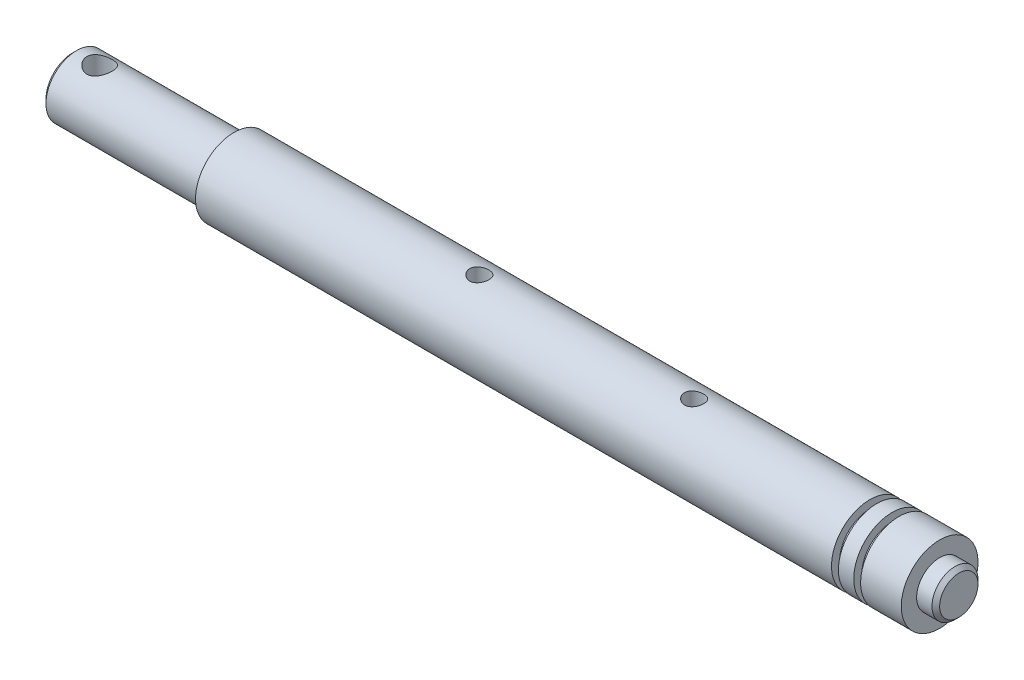
ISO-10303-21;
HEADER;
FILE_DESCRIPTION(('STEP AP214'),'2;1');
FILE_NAME('part.step','',(''),(''),'','','');
FILE_SCHEMA(('AUTOMOTIVE_DESIGN { 1 0 10303 214 1 1 1 1 }'));
ENDSEC;
DATA;
#1=APPLICATION_CONTEXT('core data for automotive mechanical design processes');
#2=APPLICATION_PROTOCOL_DEFINITION('international standard','automotive_design',2000,#1);
#3=PRODUCT_CONTEXT('',#1,'mechanical');
#4=PRODUCT('Part','Part','',(#3));
#5=PRODUCT_RELATED_PRODUCT_CATEGORY('part','',(#4));
#6=PRODUCT_DEFINITION_FORMATION('','',#4);
#7=PRODUCT_DEFINITION_CONTEXT('part definition',#1,'design');
#8=PRODUCT_DEFINITION('design','',#6,#7);
#9=PRODUCT_DEFINITION_SHAPE('','',#8);
#10=(LENGTH_UNIT() NAMED_UNIT(*) SI_UNIT(.MILLI.,.METRE.));
#11=(NAMED_UNIT(*) PLANE_ANGLE_UNIT() SI_UNIT($,.RADIAN.));
#12=(NAMED_UNIT(*) SI_UNIT($,.STERADIAN.) SOLID_ANGLE_UNIT());
#13=UNCERTAINTY_MEASURE_WITH_UNIT(LENGTH_MEASURE(1.E-05),#10,'distance_accuracy_value','');
#14=(GEOMETRIC_REPRESENTATION_CONTEXT(3) GLOBAL_UNCERTAINTY_ASSIGNED_CONTEXT((#13)) GLOBAL_UNIT_ASSIGNED_CONTEXT((#10,
#11,#12)) REPRESENTATION_CONTEXT('',''));
#15=CARTESIAN_POINT('',(0.,0.,0.));
#16=DIRECTION('',(0.,0.,1.));
#17=DIRECTION('',(1.,0.,0.));
#18=AXIS2_PLACEMENT_3D('',#15,#16,#17);
#19=CARTESIAN_POINT('',(127.142135623731,0.,0.));
#20=DIRECTION('',(-1.,0.,0.));
#21=DIRECTION('',(0.,0.,1.));
#22=AXIS2_PLACEMENT_3D('',#19,#20,#21);
#23=CYLINDRICAL_SURFACE('',#22,5.);
#24=CARTESIAN_POINT('',(104.8,0.,0.));
#25=DIRECTION('',(1.,0.,0.));
#26=DIRECTION('',(0.,0.,-1.));
#27=AXIS2_PLACEMENT_3D('',#24,#25,#26);
#28=CIRCLE('',#27,5.);
#29=CARTESIAN_POINT('',(104.8,0.,-5.));
#30=VERTEX_POINT('',#29);
#31=EDGE_CURVE('E176',#30,#30,#28,.T.);
#32=ORIENTED_EDGE('',*,*,#31,.T.);
#33=EDGE_LOOP('',(#32));
#34=FACE_BOUND('',#33,.T.);
#35=CARTESIAN_POINT('',(106.8,0.,0.));
#36=DIRECTION('',(1.,0.,0.));
#37=DIRECTION('',(0.,0.,-1.));
#38=AXIS2_PLACEMENT_3D('',#35,#36,#37);
#39=CIRCLE('',#38,5.);
#40=CARTESIAN_POINT('',(106.8,0.,-5.));
#41=VERTEX_POINT('',#40);
#42=EDGE_CURVE('E197',#41,#41,#39,.T.);
#43=ORIENTED_EDGE('',*,*,#42,.F.);
#44=EDGE_LOOP('',(#43));
#45=FACE_BOUND('',#44,.T.);
#46=ADVANCED_FACE('F45',(#34,#45),#23,.T.);
#47=CARTESIAN_POINT('',(107.7,0.,0.));
#48=DIRECTION('',(1.,0.,0.));
#49=DIRECTION('',(0.,0.,-1.));
#50=AXIS2_PLACEMENT_3D('',#47,#48,#49);
#51=PLANE('',#50);
#52=CARTESIAN_POINT('',(107.7,0.,0.));
#53=DIRECTION('',(1.,0.,0.));
#54=DIRECTION('',(0.,0.,-1.));
#55=AXIS2_PLACEMENT_3D('',#52,#53,#54);
#56=CIRCLE('',#55,5.);
#57=CARTESIAN_POINT('',(107.7,0.,-5.));
#58=VERTEX_POINT('',#57);
#59=EDGE_CURVE('E200',#58,#58,#56,.T.);
#60=ORIENTED_EDGE('',*,*,#59,.F.);
#61=EDGE_LOOP('',(#60));
#62=FACE_BOUND('',#61,.T.);
#63=CARTESIAN_POINT('',(107.7,0.,0.));
#64=DIRECTION('',(1.,0.,0.));
#65=DIRECTION('',(0.,0.,-1.));
#66=AXIS2_PLACEMENT_3D('',#63,#64,#65);
#67=CIRCLE('',#66,3.95);
#68=CARTESIAN_POINT('',(107.7,0.,-3.95));
#69=VERTEX_POINT('',#68);
#70=EDGE_CURVE('E194',#69,#69,#67,.T.);
#71=ORIENTED_EDGE('',*,*,#70,.T.);
#72=EDGE_LOOP('',(#71));
#73=FACE_BOUND('',#72,.T.);
#74=ADVANCED_FACE('F106',(#62,#73),#51,.F.);
#75=CARTESIAN_POINT('',(106.8,0.,0.));
#76=DIRECTION('',(1.,0.,0.));
#77=DIRECTION('',(0.,0.,-1.));
#78=AXIS2_PLACEMENT_3D('',#75,#76,#77);
#79=PLANE('',#78);
#80=ORIENTED_EDGE('',*,*,#42,.T.);
#81=EDGE_LOOP('',(#80));
#82=FACE_BOUND('',#81,.T.);
#83=CARTESIAN_POINT('',(106.8,0.,0.));
#84=DIRECTION('',(1.,0.,0.));
#85=DIRECTION('',(0.,0.,-1.));
#86=AXIS2_PLACEMENT_3D('',#83,#84,#85);
#87=CIRCLE('',#86,3.95);
#88=CARTESIAN_POINT('',(106.8,0.,-3.95));
#89=VERTEX_POINT('',#88);
#90=EDGE_CURVE('E188',#89,#89,#87,.T.);
#91=ORIENTED_EDGE('',*,*,#90,.F.);
#92=EDGE_LOOP('',(#91));
#93=FACE_BOUND('',#92,.T.);
#94=ADVANCED_FACE('F104',(#82,#93),#79,.T.);
#95=CARTESIAN_POINT('',(107.7,0.,0.));
#96=DIRECTION('',(-1.,0.,0.));
#97=DIRECTION('',(0.,0.,1.));
#98=AXIS2_PLACEMENT_3D('',#95,#96,#97);
#99=CYLINDRICAL_SURFACE('',#98,3.95);
#100=ORIENTED_EDGE('',*,*,#70,.F.);
#101=EDGE_LOOP('',(#100));
#102=FACE_BOUND('',#101,.T.);
#103=ORIENTED_EDGE('',*,*,#90,.T.);
#104=EDGE_LOOP('',(#103));
#105=FACE_BOUND('',#104,.T.);
#106=ADVANCED_FACE('F100',(#102,#105),#99,.T.);
#107=CARTESIAN_POINT('',(113.,-5.23389152438003,-13.8872740129595));
#108=DIRECTION('',(-1.,0.,0.));
#109=DIRECTION('',(0.,-0.978261327387222,-0.207375927577406));
#110=AXIS2_PLACEMENT_3D('',#107,#108,#109);
#111=PLANE('',#110);
#112=CARTESIAN_POINT('',(113.,0.,0.));
#113=DIRECTION('',(1.,0.,0.));
#114=DIRECTION('',(0.,0.,-1.));
#115=AXIS2_PLACEMENT_3D('',#112,#113,#114);
#116=CIRCLE('',#115,3.00000000000008);
#117=CARTESIAN_POINT('',(113.,0.,-3.00000000000008));
#118=VERTEX_POINT('',#117);
#119=EDGE_CURVE('E190',#118,#118,#116,.T.);
#120=ORIENTED_EDGE('',*,*,#119,.F.);
#121=EDGE_LOOP('',(#120));
#122=FACE_BOUND('',#121,.T.);
#123=CARTESIAN_POINT('',(113.,0.,0.));
#124=DIRECTION('',(-1.,0.,0.));
#125=DIRECTION('',(0.,-1.,0.));
#126=AXIS2_PLACEMENT_3D('',#123,#124,#125);
#127=CIRCLE('',#126,5.);
#128=CARTESIAN_POINT('',(113.,-5.,0.));
#129=VERTEX_POINT('',#128);
#130=EDGE_CURVE('E206',#129,#129,#127,.T.);
#131=ORIENTED_EDGE('',*,*,#130,.F.);
#132=EDGE_LOOP('',(#131));
#133=FACE_BOUND('',#132,.T.);
#134=ADVANCED_FACE('F103',(#122,#133),#111,.F.);
#135=ORIENTED_EDGE('',*,*,#59,.T.);
#136=EDGE_LOOP('',(#135));
#137=FACE_BOUND('',#136,.T.);
#138=ORIENTED_EDGE('',*,*,#130,.T.);
#139=EDGE_LOOP('',(#138));
#140=FACE_BOUND('',#139,.T.);
#141=ADVANCED_FACE('F73',(#137,#140),#23,.T.);
#142=CARTESIAN_POINT('',(115.5,0.,0.));
#143=DIRECTION('',(-1.,0.,0.));
#144=DIRECTION('',(0.,0.,1.));
#145=AXIS2_PLACEMENT_3D('',#142,#143,#144);
#146=CYLINDRICAL_SURFACE('',#145,3.00000000000008);
#147=CARTESIAN_POINT('',(115.,0.,0.));
#148=DIRECTION('',(1.,0.,0.));
#149=DIRECTION('',(0.,0.,-1.));
#150=AXIS2_PLACEMENT_3D('',#147,#148,#149);
#151=CIRCLE('',#150,3.00000000000008);
#152=CARTESIAN_POINT('',(115.,0.,-3.00000000000008));
#153=VERTEX_POINT('',#152);
#154=EDGE_CURVE('E62',#153,#153,#151,.F.);
#155=ORIENTED_EDGE('',*,*,#154,.T.);
#156=EDGE_LOOP('',(#155));
#157=FACE_BOUND('',#156,.T.);
#158=ORIENTED_EDGE('',*,*,#119,.T.);
#159=EDGE_LOOP('',(#158));
#160=FACE_BOUND('',#159,.T.);
#161=ADVANCED_FACE('F95',(#157,#160),#146,.T.);
#162=CARTESIAN_POINT('',(115.5,0.,0.));
#163=DIRECTION('',(1.,0.,0.));
#164=DIRECTION('',(0.,0.,-1.));
#165=AXIS2_PLACEMENT_3D('',#162,#163,#164);
#166=PLANE('',#165);
#167=CARTESIAN_POINT('',(115.5,0.,0.));
#168=DIRECTION('',(1.,0.,0.));
#169=DIRECTION('',(0.,0.,-1.));
#170=AXIS2_PLACEMENT_3D('',#167,#168,#169);
#171=CIRCLE('',#170,2.50000000000009);
#172=CARTESIAN_POINT('',(115.5,0.,-2.50000000000008));
#173=VERTEX_POINT('',#172);
#174=EDGE_CURVE('E66',#173,#173,#171,.T.);
#175=ORIENTED_EDGE('',*,*,#174,.T.);
#176=EDGE_LOOP('',(#175));
#177=FACE_BOUND('',#176,.T.);
#178=ADVANCED_FACE('F92',(#177),#166,.T.);
#179=CARTESIAN_POINT('',(115.5,0.,0.));
#180=DIRECTION('',(-1.,0.,0.));
#181=DIRECTION('',(0.,0.,1.));
#182=AXIS2_PLACEMENT_3D('',#179,#180,#181);
#183=CONICAL_SURFACE('',#182,2.50000000000009,0.785398163397441);
#184=ORIENTED_EDGE('',*,*,#154,.F.);
#185=EDGE_LOOP('',(#184));
#186=FACE_BOUND('',#185,.T.);
#187=ORIENTED_EDGE('',*,*,#174,.F.);
#188=EDGE_LOOP('',(#187));
#189=FACE_BOUND('',#188,.T.);
#190=ADVANCED_FACE('F48',(#186,#189),#183,.T.);
#191=CARTESIAN_POINT('',(103.9,0.,0.));
#192=DIRECTION('',(1.,0.,0.));
#193=DIRECTION('',(0.,0.,-1.));
#194=AXIS2_PLACEMENT_3D('',#191,#192,#193);
#195=PLANE('',#194);
#196=CARTESIAN_POINT('',(103.9,0.,0.));
#197=DIRECTION('',(1.,0.,0.));
#198=DIRECTION('',(0.,0.,-1.));
#199=AXIS2_PLACEMENT_3D('',#196,#197,#198);
#200=CIRCLE('',#199,3.95);
#201=CARTESIAN_POINT('',(103.9,0.,-3.95));
#202=VERTEX_POINT('',#201);
#203=EDGE_CURVE('E181',#202,#202,#200,.T.);
#204=ORIENTED_EDGE('',*,*,#203,.F.);
#205=EDGE_LOOP('',(#204));
#206=FACE_BOUND('',#205,.T.);
#207=CARTESIAN_POINT('',(103.9,0.,0.));
#208=DIRECTION('',(1.,0.,0.));
#209=DIRECTION('',(0.,0.,-1.));
#210=AXIS2_PLACEMENT_3D('',#207,#208,#209);
#211=CIRCLE('',#210,5.);
#212=CARTESIAN_POINT('',(103.9,0.,-5.));
#213=VERTEX_POINT('',#212);
#214=EDGE_CURVE('E173',#213,#213,#211,.T.);
#215=ORIENTED_EDGE('',*,*,#214,.T.);
#216=EDGE_LOOP('',(#215));
#217=FACE_BOUND('',#216,.T.);
#218=ADVANCED_FACE('F228',(#206,#217),#195,.T.);
#219=CARTESIAN_POINT('',(104.8,0.,0.));
#220=DIRECTION('',(1.,0.,0.));
#221=DIRECTION('',(0.,0.,-1.));
#222=AXIS2_PLACEMENT_3D('',#219,#220,#221);
#223=PLANE('',#222);
#224=CARTESIAN_POINT('',(104.8,0.,0.));
#225=DIRECTION('',(1.,0.,0.));
#226=DIRECTION('',(0.,0.,-1.));
#227=AXIS2_PLACEMENT_3D('',#224,#225,#226);
#228=CIRCLE('',#227,3.95);
#229=CARTESIAN_POINT('',(104.8,0.,-3.95));
#230=VERTEX_POINT('',#229);
#231=EDGE_CURVE('E184',#230,#230,#228,.T.);
#232=ORIENTED_EDGE('',*,*,#231,.T.);
#233=EDGE_LOOP('',(#232));
#234=FACE_BOUND('',#233,.T.);
#235=ORIENTED_EDGE('',*,*,#31,.F.);
#236=EDGE_LOOP('',(#235));
#237=FACE_BOUND('',#236,.T.);
#238=ADVANCED_FACE('F224',(#234,#237),#223,.F.);
#239=CARTESIAN_POINT('',(103.9,0.,0.));
#240=DIRECTION('',(1.,0.,0.));
#241=DIRECTION('',(0.,0.,-1.));
#242=AXIS2_PLACEMENT_3D('',#239,#240,#241);
#243=CYLINDRICAL_SURFACE('',#242,3.95);
#244=ORIENTED_EDGE('',*,*,#203,.T.);
#245=EDGE_LOOP('',(#244));
#246=FACE_BOUND('',#245,.T.);
#247=ORIENTED_EDGE('',*,*,#231,.F.);
#248=EDGE_LOOP('',(#247));
#249=FACE_BOUND('',#248,.T.);
#250=ADVANCED_FACE('F227',(#246,#249),#243,.T.);
#251=CARTESIAN_POINT('',(0.,0.,0.));
#252=DIRECTION('',(1.,0.,0.));
#253=DIRECTION('',(0.,0.,-1.));
#254=AXIS2_PLACEMENT_3D('',#251,#252,#253);
#255=PLANE('',#254);
#256=CARTESIAN_POINT('',(0.,0.,0.));
#257=DIRECTION('',(1.,0.,0.));
#258=DIRECTION('',(0.,0.,-1.));
#259=AXIS2_PLACEMENT_3D('',#256,#257,#258);
#260=CIRCLE('',#259,3.49999999999997);
#261=CARTESIAN_POINT('',(0.,0.,-3.49999999999997));
#262=VERTEX_POINT('',#261);
#263=EDGE_CURVE('E248',#262,#262,#260,.F.);
#264=ORIENTED_EDGE('',*,*,#263,.T.);
#265=EDGE_LOOP('',(#264));
#266=FACE_BOUND('',#265,.T.);
#267=ADVANCED_FACE('F118',(#266),#255,.F.);
#268=CARTESIAN_POINT('',(3.5,-13.,0.));
#269=DIRECTION('',(0.,1.,0.));
#270=DIRECTION('',(0.,0.,1.));
#271=AXIS2_PLACEMENT_3D('',#268,#269,#270);
#272=CYLINDRICAL_SURFACE('',#271,1.65);
#273=CARTESIAN_POINT('',(3.5,3.64383040220041,1.65));
#274=CARTESIAN_POINT('',(3.41190351977432,3.64383945275153,1.64999056813102));
#275=CARTESIAN_POINT('',(3.32365956802641,3.64707173267573,1.64289989177358));
#276=CARTESIAN_POINT('',(3.14971293892112,3.65959209124688,1.61480845546373));
#277=CARTESIAN_POINT('',(3.0640178994024,3.66889676295874,1.5937695789634));
#278=CARTESIAN_POINT('',(2.89799706186937,3.69231325052126,1.53873536249638));
#279=CARTESIAN_POINT('',(2.8176511797814,3.70640571161012,1.50479212400174));
#280=CARTESIAN_POINT('',(2.66381823316578,3.73778230052357,1.42506535594207));
#281=CARTESIAN_POINT('',(2.59032945721596,3.75506562873473,1.37928479159595));
#282=CARTESIAN_POINT('',(2.4477713121535,3.7920553041855,1.27419856290372));
#283=CARTESIAN_POINT('',(2.37917074421979,3.81184277704779,1.2142851824136));
#284=CARTESIAN_POINT('',(2.25264522809124,3.85094363418238,1.08391072165483));
#285=CARTESIAN_POINT('',(2.19472434852778,3.87025683535296,1.01344563996364));
#286=CARTESIAN_POINT('',(2.08882862869813,3.90721575035942,0.860301943593383));
#287=CARTESIAN_POINT('',(2.04137906729384,3.92475616703248,0.777232390113592));
#288=CARTESIAN_POINT('',(1.9613298546783,3.95520283117798,0.603436361875858));
#289=CARTESIAN_POINT('',(1.92872373565344,3.96811109652272,0.512713242513046));
#290=CARTESIAN_POINT('',(1.88097929334377,3.98726403378776,0.331105172304399));
#291=CARTESIAN_POINT('',(1.86503315207676,3.99381564337609,0.240465625184493));
#292=CARTESIAN_POINT('',(1.84845334814483,4.0006306156112,0.0575763551498659));
#293=CARTESIAN_POINT('',(1.84781360467799,4.00089647540932,-0.0346727137709545));
#294=CARTESIAN_POINT('',(1.86143649613659,3.99529224160632,-0.212297380895985));
#295=CARTESIAN_POINT('',(1.8748121837171,3.98978733384658,-0.297754665400397));
#296=CARTESIAN_POINT('',(1.91456881744776,3.97375926025944,-0.465085845235279));
#297=CARTESIAN_POINT('',(1.94095072129068,3.96323572489496,-0.546959476205493));
#298=CARTESIAN_POINT('',(2.00628766172018,3.93798907731603,-0.70629560681723));
#299=CARTESIAN_POINT('',(2.04542798992487,3.92320447216362,-0.78367197976247));
#300=CARTESIAN_POINT('',(2.1349912791866,3.89088763760773,-0.930960489992467));
#301=CARTESIAN_POINT('',(2.1854182005033,3.87335444442336,-1.00086999453932));
#302=CARTESIAN_POINT('',(2.30018823902863,3.83587133640027,-1.13638530947041));
#303=CARTESIAN_POINT('',(2.36525341089872,3.8158381454309,-1.20135746318645));
#304=CARTESIAN_POINT('',(2.50540966632157,3.77653142784555,-1.31973838423493));
#305=CARTESIAN_POINT('',(2.5805044492633,3.75725818494773,-1.37314286572202));
#306=CARTESIAN_POINT('',(2.74159840354731,3.72106607156909,-1.46845339844828));
#307=CARTESIAN_POINT('',(2.82786757169265,3.70424107982558,-1.50994179309277));
#308=CARTESIAN_POINT('',(3.00704667140589,3.67596385006485,-1.57754508127096));
#309=CARTESIAN_POINT('',(3.09995191387381,3.66450786071417,-1.60367071206121));
#310=CARTESIAN_POINT('',(3.28342289518498,3.64919091711418,-1.63821320355942));
#311=CARTESIAN_POINT('',(3.37375830118286,3.64489111171831,-1.64765569454682));
#312=CARTESIAN_POINT('',(3.5548056296986,3.64311980380967,-1.65157101672826));
#313=CARTESIAN_POINT('',(3.64551741605928,3.64564601607449,-1.64604885780402));
#314=CARTESIAN_POINT('',(3.81880100904947,3.65678944366161,-1.62112710501827));
#315=CARTESIAN_POINT('',(3.90152817967461,3.66501803861664,-1.60261202118543));
#316=CARTESIAN_POINT('',(4.06263706437997,3.68614612916707,-1.55339580262015));
#317=CARTESIAN_POINT('',(4.14101777135166,3.69904670212356,-1.52269185697123));
#318=CARTESIAN_POINT('',(4.29487900569564,3.72872477858182,-1.44853902204985));
#319=CARTESIAN_POINT('',(4.37010019477924,3.74564214050945,-1.40460979308264));
#320=CARTESIAN_POINT('',(4.51246016942973,3.78124523189864,-1.30573455409451));
#321=CARTESIAN_POINT('',(4.57959548773512,3.79993171387674,-1.25078384473684));
#322=CARTESIAN_POINT('',(4.70942962644671,3.83876011670653,-1.12627542162099));
#323=CARTESIAN_POINT('',(4.77135173704872,3.85889967217623,-1.05590387126704));
#324=CARTESIAN_POINT('',(4.88264285566207,3.89698114804694,-0.905297980080106));
#325=CARTESIAN_POINT('',(4.9320110520032,3.91492292631236,-0.825063002026906));
#326=CARTESIAN_POINT('',(5.01670413420679,3.94668767391886,-0.65651681688327));
#327=CARTESIAN_POINT('',(5.05200347500273,3.96050313975064,-0.568191273870494));
#328=CARTESIAN_POINT('',(5.10699165685875,3.98237104121022,-0.38614083360518));
#329=CARTESIAN_POINT('',(5.12668958293894,3.9904268305481,-0.292419112817563));
#330=CARTESIAN_POINT('',(5.14878822892048,3.9994889299446,-0.109187189544838));
#331=CARTESIAN_POINT('',(5.15228482874194,4.00094173424749,-0.0198303081186378));
#332=CARTESIAN_POINT('',(5.14481456562972,3.99786220239438,0.158161739195409));
#333=CARTESIAN_POINT('',(5.13385015000455,3.99333087896147,0.246797024648477));
#334=CARTESIAN_POINT('',(5.09855535786444,3.979024148364,0.417705375935874));
#335=CARTESIAN_POINT('',(5.07469555788545,3.96943363922013,0.500092371627849));
#336=CARTESIAN_POINT('',(5.01479588512001,3.94605480923816,0.659667355734158));
#337=CARTESIAN_POINT('',(4.97875367521332,3.93226568297163,0.736854343148742));
#338=CARTESIAN_POINT('',(4.89369547331361,3.90105808483759,0.887661133732617));
#339=CARTESIAN_POINT('',(4.84416874322707,3.88350423911689,0.960964214361148));
#340=CARTESIAN_POINT('',(4.73429715321,3.84685709666619,1.09852932170704));
#341=CARTESIAN_POINT('',(4.67394837691919,3.82776324400832,1.1627880603165));
#342=CARTESIAN_POINT('',(4.53941247264534,3.78859741195738,1.28487769945047));
#343=CARTESIAN_POINT('',(4.46457224311506,3.76854475207571,1.34199767947157));
#344=CARTESIAN_POINT('',(4.30573402431894,3.73105419200534,1.4429647467733));
#345=CARTESIAN_POINT('',(4.22173100829041,3.7136177396712,1.48680449811903));
#346=CARTESIAN_POINT('',(4.04727155873011,3.68370387904713,1.55944447766651));
#347=CARTESIAN_POINT('',(3.95686089190891,3.67119480418034,1.58834112875234));
#348=CARTESIAN_POINT('',(3.77195285592164,3.65281837075147,1.63017263567573));
#349=CARTESIAN_POINT('',(3.67747030912313,3.64692873900432,1.64316103312974));
#350=CARTESIAN_POINT('',(3.55513668635736,3.64414054419779,1.6493120932942));
#351=CARTESIAN_POINT('',(3.52757556771498,3.64382756923723,1.6500029523216));
#352=CARTESIAN_POINT('',(3.5,3.64383040220041,1.65));
#353=B_SPLINE_CURVE_WITH_KNOTS('',3,(#273,#274,#275,#276,#277,#278,#279,#280,#281,#282,#283,
#284,#285,#286,#287,#288,#289,#290,#291,#292,#293,#294,#295,#296,#297,#298,#299,#300,#301,#302,
#303,#304,#305,#306,#307,#308,#309,#310,#311,#312,#313,#314,#315,#316,#317,#318,#319,#320,#321,
#322,#323,#324,#325,#326,#327,#328,#329,#330,#331,#332,#333,#334,#335,#336,#337,#338,#339,#340,
#341,#342,#343,#344,#345,#346,#347,#348,#349,#350,#351,#352),.UNSPECIFIED.,.T.,.F.,(4,2,2,2,2,2,
2,2,2,2,2,2,2,2,2,2,2,2,2,2,2,2,2,2,2,2,2,2,2,2,2,2,2,2,2,2,2,2,2,4),(0.,0.264211724660745,
0.529148459018597,0.793026677872048,1.05683885985756,1.33523297260792,1.61373292676209,
1.90403076094908,2.19420198072699,2.4695381624427,2.74476495901024,3.00356896819766,
3.26239203686791,3.5251552692474,3.78801084539546,4.06907613148064,4.35024537535724,
4.64031806272423,4.9301877724111,5.20152035698263,5.47276211576042,5.72713321026166,
5.98156300028881,6.24665916965708,6.51186861189123,6.79815687284346,7.08446363898863,
7.37128791456171,7.65794504349151,7.92489841526079,8.19180661499935,8.44957452423759,
8.70739191275388,8.97680852354695,9.24632283025307,9.53374725602175,9.82133016535516,
10.1070334851925,10.3917725616094,10.4744749384332),.UNSPECIFIED.);
#354=CARTESIAN_POINT('',(3.5,3.64383040220041,1.65));
#355=VERTEX_POINT('',#354);
#356=EDGE_CURVE('E122',#355,#355,#353,.T.);
#357=ORIENTED_EDGE('',*,*,#356,.F.);
#358=EDGE_LOOP('',(#357));
#359=FACE_BOUND('',#358,.T.);
#360=CARTESIAN_POINT('',(3.5,-3.64383040220041,1.65));
#361=CARTESIAN_POINT('',(3.58809648022568,-3.64383945275152,1.64999056813102));
#362=CARTESIAN_POINT('',(3.67634043197359,-3.64707173267573,1.64289989177358));
#363=CARTESIAN_POINT('',(3.85028706107888,-3.65959209124688,1.61480845546373));
#364=CARTESIAN_POINT('',(3.9359821005976,-3.66889676295874,1.5937695789634));
#365=CARTESIAN_POINT('',(4.10200293813063,-3.69231325052125,1.53873536249638));
#366=CARTESIAN_POINT('',(4.1823488202186,-3.70640571161012,1.50479212400174));
#367=CARTESIAN_POINT('',(4.33618176683423,-3.73778230052357,1.42506535594207));
#368=CARTESIAN_POINT('',(4.40967054278404,-3.75506562873473,1.37928479159595));
#369=CARTESIAN_POINT('',(4.5522286878465,-3.7920553041855,1.27419856290372));
#370=CARTESIAN_POINT('',(4.62082925578021,-3.81184277704779,1.2142851824136));
#371=CARTESIAN_POINT('',(4.74735477190876,-3.85094363418238,1.08391072165483));
#372=CARTESIAN_POINT('',(4.80527565147222,-3.87025683535296,1.01344563996364));
#373=CARTESIAN_POINT('',(4.91117137130187,-3.90721575035942,0.860301943593382));
#374=CARTESIAN_POINT('',(4.95862093270616,-3.92475616703248,0.77723239011359));
#375=CARTESIAN_POINT('',(5.0386701453217,-3.95520283117798,0.603436361875856));
#376=CARTESIAN_POINT('',(5.07127626434656,-3.96811109652272,0.512713242513044));
#377=CARTESIAN_POINT('',(5.11902070665623,-3.98726403378776,0.331105172304397));
#378=CARTESIAN_POINT('',(5.13496684792324,-3.99381564337609,0.240465625184491));
#379=CARTESIAN_POINT('',(5.15154665185517,-4.0006306156112,0.0575763551498641));
#380=CARTESIAN_POINT('',(5.15218639532201,-4.00089647540932,-0.0346727137709562));
#381=CARTESIAN_POINT('',(5.13856350386341,-3.99529224160632,-0.212297380895986));
#382=CARTESIAN_POINT('',(5.1251878162829,-3.98978733384658,-0.297754665400398));
#383=CARTESIAN_POINT('',(5.08543118255224,-3.97375926025944,-0.46508584523528));
#384=CARTESIAN_POINT('',(5.05904927870932,-3.96323572489496,-0.546959476205493));
#385=CARTESIAN_POINT('',(4.99371233827982,-3.93798907731603,-0.70629560681723));
#386=CARTESIAN_POINT('',(4.95457201007513,-3.92320447216362,-0.783671979762471));
#387=CARTESIAN_POINT('',(4.8650087208134,-3.89088763760773,-0.930960489992467));
#388=CARTESIAN_POINT('',(4.8145817994967,-3.87335444442336,-1.00086999453932));
#389=CARTESIAN_POINT('',(4.69981176097137,-3.83587133640027,-1.13638530947041));
#390=CARTESIAN_POINT('',(4.63474658910128,-3.8158381454309,-1.20135746318645));
#391=CARTESIAN_POINT('',(4.49459033367843,-3.77653142784555,-1.31973838423493));
#392=CARTESIAN_POINT('',(4.4194955507367,-3.75725818494773,-1.37314286572202));
#393=CARTESIAN_POINT('',(4.25840159645269,-3.72106607156909,-1.46845339844828));
#394=CARTESIAN_POINT('',(4.17213242830735,-3.70424107982558,-1.50994179309277));
#395=CARTESIAN_POINT('',(3.99295332859411,-3.67596385006485,-1.57754508127096));
#396=CARTESIAN_POINT('',(3.90004808612619,-3.66450786071417,-1.60367071206121));
#397=CARTESIAN_POINT('',(3.71657710481502,-3.64919091711418,-1.63821320355942));
#398=CARTESIAN_POINT('',(3.62624169881714,-3.64489111171831,-1.64765569454682));
#399=CARTESIAN_POINT('',(3.4451943703014,-3.64311980380967,-1.65157101672826));
#400=CARTESIAN_POINT('',(3.35448258394072,-3.64564601607449,-1.64604885780402));
#401=CARTESIAN_POINT('',(3.18119899095053,-3.65678944366161,-1.62112710501826));
#402=CARTESIAN_POINT('',(3.09847182032539,-3.66501803861665,-1.60261202118543));
#403=CARTESIAN_POINT('',(2.93736293562003,-3.68614612916707,-1.55339580262015));
#404=CARTESIAN_POINT('',(2.85898222864834,-3.69904670212356,-1.52269185697123));
#405=CARTESIAN_POINT('',(2.70512099430436,-3.72872477858182,-1.44853902204985));
#406=CARTESIAN_POINT('',(2.62989980522075,-3.74564214050945,-1.40460979308264));
#407=CARTESIAN_POINT('',(2.48753983057027,-3.78124523189864,-1.30573455409451));
#408=CARTESIAN_POINT('',(2.42040451226488,-3.79993171387674,-1.25078384473684));
#409=CARTESIAN_POINT('',(2.29057037355329,-3.83876011670653,-1.12627542162099));
#410=CARTESIAN_POINT('',(2.22864826295128,-3.85889967217623,-1.05590387126704));
#411=CARTESIAN_POINT('',(2.11735714433793,-3.89698114804694,-0.905297980080104));
#412=CARTESIAN_POINT('',(2.0679889479968,-3.91492292631236,-0.825063002026905));
#413=CARTESIAN_POINT('',(1.98329586579321,-3.94668767391886,-0.656516816883269));
#414=CARTESIAN_POINT('',(1.94799652499727,-3.96050313975064,-0.568191273870493));
#415=CARTESIAN_POINT('',(1.89300834314125,-3.98237104121021,-0.386140833605179));
#416=CARTESIAN_POINT('',(1.87331041706106,-3.9904268305481,-0.292419112817562));
#417=CARTESIAN_POINT('',(1.85121177107952,-3.9994889299446,-0.109187189544837));
#418=CARTESIAN_POINT('',(1.84771517125806,-4.00094173424749,-0.0198303081186369));
#419=CARTESIAN_POINT('',(1.85518543437028,-3.99786220239438,0.15816173919541));
#420=CARTESIAN_POINT('',(1.86614984999545,-3.99333087896147,0.246797024648479));
#421=CARTESIAN_POINT('',(1.90144464213556,-3.979024148364,0.417705375935876));
#422=CARTESIAN_POINT('',(1.92530444211455,-3.96943363922013,0.500092371627851));
#423=CARTESIAN_POINT('',(1.98520411487999,-3.94605480923816,0.65966735573416));
#424=CARTESIAN_POINT('',(2.02124632478668,-3.93226568297163,0.736854343148744));
#425=CARTESIAN_POINT('',(2.10630452668639,-3.90105808483759,0.887661133732619));
#426=CARTESIAN_POINT('',(2.15583125677293,-3.88350423911689,0.960964214361149));
#427=CARTESIAN_POINT('',(2.26570284679,-3.84685709666619,1.09852932170705));
#428=CARTESIAN_POINT('',(2.32605162308081,-3.82776324400832,1.1627880603165));
#429=CARTESIAN_POINT('',(2.46058752735466,-3.78859741195738,1.28487769945047));
#430=CARTESIAN_POINT('',(2.53542775688494,-3.76854475207571,1.34199767947157));
#431=CARTESIAN_POINT('',(2.69426597568106,-3.73105419200534,1.4429647467733));
#432=CARTESIAN_POINT('',(2.77826899170959,-3.7136177396712,1.48680449811903));
#433=CARTESIAN_POINT('',(2.95272844126989,-3.68370387904713,1.55944447766651));
#434=CARTESIAN_POINT('',(3.0431391080911,-3.67119480418033,1.58834112875234));
#435=CARTESIAN_POINT('',(3.22804714407836,-3.65281837075147,1.63017263567573));
#436=CARTESIAN_POINT('',(3.32252969087687,-3.64692873900432,1.64316103312974));
#437=CARTESIAN_POINT('',(3.44486331364264,-3.64414054419779,1.6493120932942));
#438=CARTESIAN_POINT('',(3.47242443228502,-3.64382756923722,1.6500029523216));
#439=CARTESIAN_POINT('',(3.5,-3.64383040220041,1.65));
#440=B_SPLINE_CURVE_WITH_KNOTS('',3,(#360,#361,#362,#363,#364,#365,#366,#367,#368,#369,#370,
#371,#372,#373,#374,#375,#376,#377,#378,#379,#380,#381,#382,#383,#384,#385,#386,#387,#388,#389,
#390,#391,#392,#393,#394,#395,#396,#397,#398,#399,#400,#401,#402,#403,#404,#405,#406,#407,#408,
#409,#410,#411,#412,#413,#414,#415,#416,#417,#418,#419,#420,#421,#422,#423,#424,#425,#426,#427,
#428,#429,#430,#431,#432,#433,#434,#435,#436,#437,#438,#439),.UNSPECIFIED.,.T.,.F.,(4,2,2,2,2,2,
2,2,2,2,2,2,2,2,2,2,2,2,2,2,2,2,2,2,2,2,2,2,2,2,2,2,2,2,2,2,2,2,2,4),(0.,0.264211724660744,
0.529148459018597,0.79302667787205,1.05683885985756,1.33523297260792,1.6137329267621,
1.90403076094908,2.19420198072699,2.4695381624427,2.74476495901024,3.00356896819766,
3.26239203686791,3.5251552692474,3.78801084539546,4.06907613148065,4.35024537535724,
4.64031806272423,4.93018777241111,5.20152035698263,5.47276211576042,5.72713321026166,
5.98156300028881,6.24665916965709,6.51186861189124,6.79815687284347,7.08446363898863,
7.37128791456171,7.65794504349151,7.92489841526079,8.19180661499935,8.44957452423759,
8.70739191275388,8.97680852354695,9.24632283025307,9.53374725602175,9.82133016535516,
10.1070334851925,10.3917725616094,10.4744749384332),.UNSPECIFIED.);
#441=CARTESIAN_POINT('',(3.5,-3.64383040220041,1.65));
#442=VERTEX_POINT('',#441);
#443=EDGE_CURVE('E129',#442,#442,#440,.T.);
#444=ORIENTED_EDGE('',*,*,#443,.F.);
#445=EDGE_LOOP('',(#444));
#446=FACE_BOUND('',#445,.T.);
#447=ADVANCED_FACE('F113',(#359,#446),#272,.F.);
#448=CARTESIAN_POINT('',(0.500000000000011,0.,0.));
#449=DIRECTION('',(1.,0.,0.));
#450=DIRECTION('',(0.,0.,-1.));
#451=AXIS2_PLACEMENT_3D('',#448,#449,#450);
#452=CONICAL_SURFACE('',#451,4.,0.785398163397463);
#453=ORIENTED_EDGE('',*,*,#263,.F.);
#454=EDGE_LOOP('',(#453));
#455=FACE_BOUND('',#454,.T.);
#456=CARTESIAN_POINT('',(0.500000000000011,0.,0.));
#457=DIRECTION('',(1.,0.,0.));
#458=DIRECTION('',(0.,0.,-1.));
#459=AXIS2_PLACEMENT_3D('',#456,#457,#458);
#460=CIRCLE('',#459,4.);
#461=CARTESIAN_POINT('',(0.500000000000011,0.,-4.));
#462=VERTEX_POINT('',#461);
#463=EDGE_CURVE('E136',#462,#462,#460,.T.);
#464=ORIENTED_EDGE('',*,*,#463,.F.);
#465=EDGE_LOOP('',(#464));
#466=FACE_BOUND('',#465,.T.);
#467=ADVANCED_FACE('F117',(#455,#466),#452,.T.);
#468=CARTESIAN_POINT('',(21.,0.,0.));
#469=DIRECTION('',(-1.,0.,0.));
#470=DIRECTION('',(0.,0.,1.));
#471=AXIS2_PLACEMENT_3D('',#468,#469,#470);
#472=CYLINDRICAL_SURFACE('',#471,4.);
#473=ORIENTED_EDGE('',*,*,#463,.T.);
#474=EDGE_LOOP('',(#473));
#475=FACE_BOUND('',#474,.T.);
#476=ORIENTED_EDGE('',*,*,#443,.T.);
#477=EDGE_LOOP('',(#476));
#478=FACE_BOUND('',#477,.T.);
#479=ORIENTED_EDGE('',*,*,#356,.T.);
#480=EDGE_LOOP('',(#479));
#481=FACE_BOUND('',#480,.T.);
#482=CARTESIAN_POINT('',(21.,0.,0.));
#483=DIRECTION('',(1.,0.,0.));
#484=DIRECTION('',(0.,0.,-1.));
#485=AXIS2_PLACEMENT_3D('',#482,#483,#484);
#486=CIRCLE('',#485,4.);
#487=CARTESIAN_POINT('',(21.,0.,-4.));
#488=VERTEX_POINT('',#487);
#489=EDGE_CURVE('E193',#488,#488,#486,.T.);
#490=ORIENTED_EDGE('',*,*,#489,.F.);
#491=EDGE_LOOP('',(#490));
#492=FACE_BOUND('',#491,.T.);
#493=ADVANCED_FACE('F90',(#475,#478,#481,#492),#472,.T.);
#494=CARTESIAN_POINT('',(53.,-2.,0.));
#495=DIRECTION('',(0.,1.,0.));
#496=DIRECTION('',(0.,0.,1.));
#497=AXIS2_PLACEMENT_3D('',#494,#495,#496);
#498=PLANE('',#497);
#499=CARTESIAN_POINT('',(53.,-2.,0.));
#500=DIRECTION('',(0.,1.,0.));
#501=DIRECTION('',(0.,0.,1.));
#502=AXIS2_PLACEMENT_3D('',#499,#500,#501);
#503=CIRCLE('',#502,1.25);
#504=CARTESIAN_POINT('',(53.,-2.,1.25));
#505=VERTEX_POINT('',#504);
#506=EDGE_CURVE('E175',#505,#505,#503,.T.);
#507=ORIENTED_EDGE('',*,*,#506,.T.);
#508=EDGE_LOOP('',(#507));
#509=FACE_BOUND('',#508,.T.);
#510=ADVANCED_FACE('F86',(#509),#498,.T.);
#511=CARTESIAN_POINT('',(81.,-2.,0.));
#512=DIRECTION('',(0.,1.,0.));
#513=DIRECTION('',(0.,0.,1.));
#514=AXIS2_PLACEMENT_3D('',#511,#512,#513);
#515=PLANE('',#514);
#516=CARTESIAN_POINT('',(81.,-2.,0.));
#517=DIRECTION('',(0.,1.,0.));
#518=DIRECTION('',(0.,0.,1.));
#519=AXIS2_PLACEMENT_3D('',#516,#517,#518);
#520=CIRCLE('',#519,1.25);
#521=CARTESIAN_POINT('',(81.,-2.,1.25));
#522=VERTEX_POINT('',#521);
#523=EDGE_CURVE('E179',#522,#522,#520,.T.);
#524=ORIENTED_EDGE('',*,*,#523,.T.);
#525=EDGE_LOOP('',(#524));
#526=FACE_BOUND('',#525,.T.);
#527=ADVANCED_FACE('F89',(#526),#515,.T.);
#528=CARTESIAN_POINT('',(21.,0.,0.));
#529=DIRECTION('',(1.,0.,0.));
#530=DIRECTION('',(0.,0.,-1.));
#531=AXIS2_PLACEMENT_3D('',#528,#529,#530);
#532=PLANE('',#531);
#533=ORIENTED_EDGE('',*,*,#489,.T.);
#534=EDGE_LOOP('',(#533));
#535=FACE_BOUND('',#534,.T.);
#536=CARTESIAN_POINT('',(21.,0.,0.));
#537=DIRECTION('',(1.,0.,0.));
#538=DIRECTION('',(0.,0.,-1.));
#539=AXIS2_PLACEMENT_3D('',#536,#537,#538);
#540=CIRCLE('',#539,5.);
#541=CARTESIAN_POINT('',(21.,0.,-5.));
#542=VERTEX_POINT('',#541);
#543=EDGE_CURVE('E135',#542,#542,#540,.T.);
#544=ORIENTED_EDGE('',*,*,#543,.F.);
#545=EDGE_LOOP('',(#544));
#546=FACE_BOUND('',#545,.T.);
#547=ADVANCED_FACE('F82',(#535,#546),#532,.F.);
#548=CARTESIAN_POINT('',(53.,-2.,0.));
#549=DIRECTION('',(0.,1.,0.));
#550=DIRECTION('',(0.,0.,1.));
#551=AXIS2_PLACEMENT_3D('',#548,#549,#550);
#552=CYLINDRICAL_SURFACE('',#551,1.25);
#553=ORIENTED_EDGE('',*,*,#506,.F.);
#554=EDGE_LOOP('',(#553));
#555=FACE_BOUND('',#554,.T.);
#556=CARTESIAN_POINT('',(53.,4.84122918275927,1.25));
#557=CARTESIAN_POINT('',(52.9309746245377,4.84123050042654,1.24999803929589));
#558=CARTESIAN_POINT('',(52.861927550661,4.84272153006957,1.24426312274865));
#559=CARTESIAN_POINT('',(52.725816210913,4.84850930996624,1.22151156273207));
#560=CARTESIAN_POINT('',(52.6587531227659,4.85280769310907,1.2044883533711));
#561=CARTESIAN_POINT('',(52.5285982309065,4.86369362297984,1.15974559981597));
#562=CARTESIAN_POINT('',(52.4655014223072,4.87027821345204,1.13203986392723));
#563=CARTESIAN_POINT('',(52.3448445737301,4.88499096014404,1.0667605706307));
#564=CARTESIAN_POINT('',(52.2872847689599,4.89311918189251,1.02918659428034));
#565=CARTESIAN_POINT('',(52.1780691773689,4.91020358177806,0.944354213655939));
#566=CARTESIAN_POINT('',(52.126553199825,4.91917298811515,0.896918443852027));
#567=CARTESIAN_POINT('',(52.0321193028198,4.93681437757649,0.794091032050336));
#568=CARTESIAN_POINT('',(51.9892021871891,4.94548633283195,0.738698647090158));
#569=CARTESIAN_POINT('',(51.9126122661844,4.96170207760291,0.620572600539483));
#570=CARTESIAN_POINT('',(51.8790768059193,4.96922843700296,0.557747288097566));
#571=CARTESIAN_POINT('',(51.8230951779235,4.98215405962992,0.427131592146388));
#572=CARTESIAN_POINT('',(51.8006473740423,4.98755363667172,0.359341942895976));
#573=CARTESIAN_POINT('',(51.7679260827107,4.9955237942409,0.222179379377086));
#574=CARTESIAN_POINT('',(51.7574151778367,4.99814946922157,0.152866359774493));
#575=CARTESIAN_POINT('',(51.7481208103622,5.00046797053649,0.0134144096313904));
#576=CARTESIAN_POINT('',(51.7493356138952,5.00016123048352,-0.0567243972690286));
#577=CARTESIAN_POINT('',(51.7632874251251,4.99669047476767,-0.194190308965479));
#578=CARTESIAN_POINT('',(51.7757681625269,4.99359001170437,-0.261545269501328));
#579=CARTESIAN_POINT('',(51.8114856350243,4.98495418262427,-0.393172809267103));
#580=CARTESIAN_POINT('',(51.8347229426887,4.9794186869922,-0.457445224213043));
#581=CARTESIAN_POINT('',(51.8915012853435,4.96643754850448,-0.581758379377252));
#582=CARTESIAN_POINT('',(51.9251335223309,4.95897509847527,-0.641755637208123));
#583=CARTESIAN_POINT('',(52.0016778395581,4.94294951904825,-0.755344527925603));
#584=CARTESIAN_POINT('',(52.0445915342803,4.93438619826245,-0.808935043856876));
#585=CARTESIAN_POINT('',(52.1398543709912,4.9168185688476,-0.909717543856189));
#586=CARTESIAN_POINT('',(52.1924274461739,4.90780859762959,-0.956697098843992));
#587=CARTESIAN_POINT('',(52.3047999867701,4.89057521758353,-1.04122046995377));
#588=CARTESIAN_POINT('',(52.3645997897455,4.88235184552985,-1.07876384505752));
#589=CARTESIAN_POINT('',(52.4901450170745,4.86760248415824,-1.14348516127824));
#590=CARTESIAN_POINT('',(52.5559178651566,4.8610849186286,-1.17061195871311));
#591=CARTESIAN_POINT('',(52.6912927340382,4.85059320069979,-1.21335702579542));
#592=CARTESIAN_POINT('',(52.7608939319916,4.84661850405109,-1.22897775819113));
#593=CARTESIAN_POINT('',(52.8999797507616,4.8417767801957,-1.24791481933259));
#594=CARTESIAN_POINT('',(52.9694188966648,4.84083044546824,-1.25154523695981));
#595=CARTESIAN_POINT('',(53.1079109682891,4.8419367174052,-1.24725849525777));
#596=CARTESIAN_POINT('',(53.1769639289756,4.84398904800633,-1.2393423989244));
#597=CARTESIAN_POINT('',(53.3115571324774,4.8507854097728,-1.21246273196883));
#598=CARTESIAN_POINT('',(53.3771363632854,4.85548485117188,-1.19368203414087));
#599=CARTESIAN_POINT('',(53.5042157289258,4.86700359135481,-1.14580904083531));
#600=CARTESIAN_POINT('',(53.5657153795277,4.87382314124307,-1.11671552385627));
#601=CARTESIAN_POINT('',(53.6842206389337,4.88898068546631,-1.04838533396828));
#602=CARTESIAN_POINT('',(53.7411144200216,4.89734584303321,-1.00896087691781));
#603=CARTESIAN_POINT('',(53.8475941814007,4.91458541535858,-0.921325366168066));
#604=CARTESIAN_POINT('',(53.897178958325,4.92345991364235,-0.873112868506796));
#605=CARTESIAN_POINT('',(53.9889055212855,4.94098701515803,-0.767828401230906));
#606=CARTESIAN_POINT('',(54.0308300312744,4.94962851030918,-0.710564940664491));
#607=CARTESIAN_POINT('',(54.1044679334756,4.96548608306867,-0.589628353368346));
#608=CARTESIAN_POINT('',(54.1361818583041,4.9727022350198,-0.525955561196991));
#609=CARTESIAN_POINT('',(54.188223017264,4.98485057869157,-0.394447752163866));
#610=CARTESIAN_POINT('',(54.2086321421895,4.98979915011205,-0.326646726284856));
#611=CARTESIAN_POINT('',(54.2377301673042,4.99692646697894,-0.188437200398516));
#612=CARTESIAN_POINT('',(54.2464213293695,4.99910574696704,-0.118029206301561));
#613=CARTESIAN_POINT('',(54.2517094869694,5.00042711761014,0.0213544080541516));
#614=CARTESIAN_POINT('',(54.2486271363692,4.9996497360001,0.0903172837075352));
#615=CARTESIAN_POINT('',(54.2311902158821,4.9953237057178,0.226709370518418));
#616=CARTESIAN_POINT('',(54.2168359812336,4.99177513946369,0.294138627226102));
#617=CARTESIAN_POINT('',(54.1774347252863,4.98231791067453,0.425213794556013));
#618=CARTESIAN_POINT('',(54.1524456833567,4.97642205628333,0.488878118226266));
#619=CARTESIAN_POINT('',(54.0925367762258,4.9628911114173,0.611146316301829));
#620=CARTESIAN_POINT('',(54.057615659163,4.9552558017217,0.669749551581309));
#621=CARTESIAN_POINT('',(53.9778559575037,4.93884062101666,0.781752410529869));
#622=CARTESIAN_POINT('',(53.9327998213658,4.93003771182014,0.834993735375723));
#623=CARTESIAN_POINT('',(53.8344714350328,4.91238311316553,0.933268775339062));
#624=CARTESIAN_POINT('',(53.7811971048776,4.90353141190695,0.978300406335231));
#625=CARTESIAN_POINT('',(53.6667482322483,4.88659344825685,1.05970253309903));
#626=CARTESIAN_POINT('',(53.6054448457342,4.87852454662356,1.09589577430818));
#627=CARTESIAN_POINT('',(53.4774306375966,4.8642994443827,1.15740862076957));
#628=CARTESIAN_POINT('',(53.4107237923666,4.85814185308378,1.18273613719964));
#629=CARTESIAN_POINT('',(53.2867787352166,4.84939885924729,1.21802816070679));
#630=CARTESIAN_POINT('',(53.2301335445202,4.84635828750683,1.22999146324422));
#631=CARTESIAN_POINT('',(53.1156639137501,4.84227298231965,1.24597786571658));
#632=CARTESIAN_POINT('',(53.0578395746937,4.84122807862454,1.25000164296523));
#633=CARTESIAN_POINT('',(53.,4.84122918275927,1.25));
#634=B_SPLINE_CURVE_WITH_KNOTS('',3,(#556,#557,#558,#559,#560,#561,#562,#563,#564,#565,#566,
#567,#568,#569,#570,#571,#572,#573,#574,#575,#576,#577,#578,#579,#580,#581,#582,#583,#584,#585,
#586,#587,#588,#589,#590,#591,#592,#593,#594,#595,#596,#597,#598,#599,#600,#601,#602,#603,#604,
#605,#606,#607,#608,#609,#610,#611,#612,#613,#614,#615,#616,#617,#618,#619,#620,#621,#622,#623,
#624,#625,#626,#627,#628,#629,#630,#631,#632,#633),.UNSPECIFIED.,.T.,.F.,(4,2,2,2,2,2,2,2,2,2,2,
2,2,2,2,2,2,2,2,2,2,2,2,2,2,2,2,2,2,2,2,2,2,2,2,2,2,2,4),(0.,0.206863720868061,
0.413847870714328,0.620565363583011,0.827291633777385,1.03811977096487,1.24896760739932,
1.46275748198959,1.67651579923545,1.88594375497672,2.09534074333009,2.30009131344472,
2.50485278362392,2.71146437127221,2.91811192734455,3.13035233285954,3.342602655999,
3.55588216004199,3.76911600064772,3.97671787380858,4.184300635919,4.38848702504602,
4.59269760710708,4.80091422929578,5.00916509442521,5.22262665482658,5.43607707859775,
5.64796036403463,5.85980274454517,6.06591723063726,6.27202558688489,6.47702438279854,
6.68204902869034,6.89198548291033,7.10197515782752,7.31588238642336,7.52963360683307,
7.70298913588663,7.87632987549759),.UNSPECIFIED.);
#635=CARTESIAN_POINT('',(53.,4.84122918275927,1.25));
#636=VERTEX_POINT('',#635);
#637=EDGE_CURVE('E58',#636,#636,#634,.T.);
#638=ORIENTED_EDGE('',*,*,#637,.F.);
#639=EDGE_LOOP('',(#638));
#640=FACE_BOUND('',#639,.T.);
#641=ADVANCED_FACE('F77',(#555,#640),#552,.F.);
#642=CARTESIAN_POINT('',(81.,-2.,0.));
#643=DIRECTION('',(0.,1.,0.));
#644=DIRECTION('',(0.,0.,1.));
#645=AXIS2_PLACEMENT_3D('',#642,#643,#644);
#646=CYLINDRICAL_SURFACE('',#645,1.25);
#647=ORIENTED_EDGE('',*,*,#523,.F.);
#648=EDGE_LOOP('',(#647));
#649=FACE_BOUND('',#648,.T.);
#650=CARTESIAN_POINT('',(81.,4.84122918275927,1.25));
#651=CARTESIAN_POINT('',(80.9309746245377,4.84123050042654,1.24999803929589));
#652=CARTESIAN_POINT('',(80.861927550661,4.84272153006957,1.24426312274865));
#653=CARTESIAN_POINT('',(80.725816210913,4.84850930996624,1.22151156273207));
#654=CARTESIAN_POINT('',(80.6587531227659,4.85280769310907,1.2044883533711));
#655=CARTESIAN_POINT('',(80.5285982309065,4.86369362297984,1.15974559981597));
#656=CARTESIAN_POINT('',(80.4655014223072,4.87027821345204,1.13203986392723));
#657=CARTESIAN_POINT('',(80.3448445737301,4.88499096014404,1.06676057063071));
#658=CARTESIAN_POINT('',(80.2872847689599,4.89311918189251,1.02918659428035));
#659=CARTESIAN_POINT('',(80.1780691773689,4.91020358177806,0.944354213655938));
#660=CARTESIAN_POINT('',(80.126553199825,4.91917298811515,0.896918443852022));
#661=CARTESIAN_POINT('',(80.0321193028199,4.93681437757649,0.794091032050328));
#662=CARTESIAN_POINT('',(79.9892021871892,4.94548633283195,0.73869864709015));
#663=CARTESIAN_POINT('',(79.9126122661844,4.96170207760291,0.620572600539477));
#664=CARTESIAN_POINT('',(79.8790768059193,4.96922843700296,0.557747288097562));
#665=CARTESIAN_POINT('',(79.8230951779235,4.98215405962992,0.427131592146388));
#666=CARTESIAN_POINT('',(79.8006473740423,4.98755363667172,0.359341942895979));
#667=CARTESIAN_POINT('',(79.7679260827107,4.9955237942409,0.222179379377091));
#668=CARTESIAN_POINT('',(79.7574151778367,4.99814946922157,0.152866359774498));
#669=CARTESIAN_POINT('',(79.7481208103622,5.00046797053649,0.013414409631393));
#670=CARTESIAN_POINT('',(79.7493356138952,5.00016123048352,-0.0567243972690267));
#671=CARTESIAN_POINT('',(79.7632874251251,4.99669047476767,-0.194190308965477));
#672=CARTESIAN_POINT('',(79.7757681625269,4.99359001170437,-0.261545269501327));
#673=CARTESIAN_POINT('',(79.8114856350243,4.98495418262427,-0.393172809267101));
#674=CARTESIAN_POINT('',(79.8347229426887,4.9794186869922,-0.457445224213041));
#675=CARTESIAN_POINT('',(79.8915012853435,4.96643754850448,-0.581758379377252));
#676=CARTESIAN_POINT('',(79.9251335223309,4.95897509847527,-0.641755637208123));
#677=CARTESIAN_POINT('',(80.0016778395581,4.94294951904825,-0.755344527925603));
#678=CARTESIAN_POINT('',(80.0445915342803,4.93438619826245,-0.808935043856874));
#679=CARTESIAN_POINT('',(80.1398543709912,4.9168185688476,-0.909717543856188));
#680=CARTESIAN_POINT('',(80.1924274461739,4.90780859762959,-0.956697098843993));
#681=CARTESIAN_POINT('',(80.3047999867701,4.89057521758353,-1.04122046995377));
#682=CARTESIAN_POINT('',(80.3645997897455,4.88235184552985,-1.07876384505752));
#683=CARTESIAN_POINT('',(80.4901450170745,4.86760248415824,-1.14348516127824));
#684=CARTESIAN_POINT('',(80.5559178651566,4.8610849186286,-1.17061195871311));
#685=CARTESIAN_POINT('',(80.6912927340382,4.85059320069979,-1.21335702579542));
#686=CARTESIAN_POINT('',(80.7608939319916,4.84661850405109,-1.22897775819113));
#687=CARTESIAN_POINT('',(80.8999797507616,4.8417767801957,-1.24791481933259));
#688=CARTESIAN_POINT('',(80.9694188966648,4.84083044546824,-1.25154523695981));
#689=CARTESIAN_POINT('',(81.1079109682891,4.8419367174052,-1.24725849525777));
#690=CARTESIAN_POINT('',(81.1769639289756,4.84398904800633,-1.2393423989244));
#691=CARTESIAN_POINT('',(81.3115571324774,4.8507854097728,-1.21246273196883));
#692=CARTESIAN_POINT('',(81.3771363632854,4.85548485117188,-1.19368203414087));
#693=CARTESIAN_POINT('',(81.5042157289259,4.86700359135481,-1.14580904083531));
#694=CARTESIAN_POINT('',(81.5657153795277,4.87382314124307,-1.11671552385627));
#695=CARTESIAN_POINT('',(81.6842206389337,4.88898068546631,-1.04838533396828));
#696=CARTESIAN_POINT('',(81.7411144200216,4.89734584303321,-1.00896087691782));
#697=CARTESIAN_POINT('',(81.8475941814007,4.91458541535858,-0.921325366168075));
#698=CARTESIAN_POINT('',(81.897178958325,4.92345991364235,-0.873112868506802));
#699=CARTESIAN_POINT('',(81.9889055212855,4.94098701515803,-0.767828401230908));
#700=CARTESIAN_POINT('',(82.0308300312744,4.94962851030918,-0.71056494066449));
#701=CARTESIAN_POINT('',(82.1044679334756,4.96548608306867,-0.589628353368341));
#702=CARTESIAN_POINT('',(82.1361818583041,4.9727022350198,-0.525955561196986));
#703=CARTESIAN_POINT('',(82.188223017264,4.98485057869157,-0.394447752163862));
#704=CARTESIAN_POINT('',(82.2086321421895,4.98979915011205,-0.326646726284853));
#705=CARTESIAN_POINT('',(82.2377301673042,4.99692646697894,-0.188437200398514));
#706=CARTESIAN_POINT('',(82.2464213293695,4.99910574696704,-0.11802920630156));
#707=CARTESIAN_POINT('',(82.2517094869694,5.00042711761014,0.021354408054151));
#708=CARTESIAN_POINT('',(82.2486271363693,4.9996497360001,0.0903172837075339));
#709=CARTESIAN_POINT('',(82.2311902158821,4.9953237057178,0.226709370518417));
#710=CARTESIAN_POINT('',(82.2168359812336,4.99177513946369,0.294138627226102));
#711=CARTESIAN_POINT('',(82.1774347252864,4.98231791067453,0.425213794556013));
#712=CARTESIAN_POINT('',(82.1524456833567,4.97642205628333,0.488878118226265));
#713=CARTESIAN_POINT('',(82.0925367762259,4.9628911114173,0.611146316301828));
#714=CARTESIAN_POINT('',(82.0576156591631,4.9552558017217,0.669749551581308));
#715=CARTESIAN_POINT('',(81.9778559575037,4.93884062101666,0.781752410529868));
#716=CARTESIAN_POINT('',(81.9327998213658,4.93003771182014,0.834993735375721));
#717=CARTESIAN_POINT('',(81.8344714350328,4.91238311316553,0.933268775339059));
#718=CARTESIAN_POINT('',(81.7811971048776,4.90353141190695,0.978300406335229));
#719=CARTESIAN_POINT('',(81.6667482322484,4.88659344825685,1.05970253309903));
#720=CARTESIAN_POINT('',(81.6054448457342,4.87852454662356,1.09589577430818));
#721=CARTESIAN_POINT('',(81.4774306375966,4.8642994443827,1.15740862076958));
#722=CARTESIAN_POINT('',(81.4107237923666,4.85814185308378,1.18273613719965));
#723=CARTESIAN_POINT('',(81.2867787352166,4.84939885924729,1.2180281607068));
#724=CARTESIAN_POINT('',(81.2301335445202,4.84635828750683,1.22999146324422));
#725=CARTESIAN_POINT('',(81.1156639137501,4.84227298231965,1.24597786571658));
#726=CARTESIAN_POINT('',(81.0578395746937,4.84122807862454,1.25000164296523));
#727=CARTESIAN_POINT('',(81.,4.84122918275927,1.25));
#728=B_SPLINE_CURVE_WITH_KNOTS('',3,(#650,#651,#652,#653,#654,#655,#656,#657,#658,#659,#660,
#661,#662,#663,#664,#665,#666,#667,#668,#669,#670,#671,#672,#673,#674,#675,#676,#677,#678,#679,
#680,#681,#682,#683,#684,#685,#686,#687,#688,#689,#690,#691,#692,#693,#694,#695,#696,#697,#698,
#699,#700,#701,#702,#703,#704,#705,#706,#707,#708,#709,#710,#711,#712,#713,#714,#715,#716,#717,
#718,#719,#720,#721,#722,#723,#724,#725,#726,#727),.UNSPECIFIED.,.T.,.F.,(4,2,2,2,2,2,2,2,2,2,2,
2,2,2,2,2,2,2,2,2,2,2,2,2,2,2,2,2,2,2,2,2,2,2,2,2,2,2,4),(0.,0.206863720868061,
0.413847870714327,0.620565363582996,0.827291633777384,1.03811977096488,1.24896760739933,
1.46275748198959,1.67651579923545,1.88594375497672,2.09534074333009,2.30009131344472,
2.50485278362392,2.71146437127221,2.91811192734455,3.13035233285955,3.342602655999,
3.55588216004201,3.76911600064773,3.9767178738086,4.184300635919,4.38848702504602,
4.59269760710707,4.80091422929577,5.00916509442521,5.22262665482659,5.43607707859776,
5.64796036403463,5.85980274454518,6.06591723063727,6.27202558688489,6.47702438279854,
6.68204902869035,6.89198548291033,7.10197515782753,7.31588238642337,7.52963360683308,
7.70298913588664,7.87632987549759),.UNSPECIFIED.);
#729=CARTESIAN_POINT('',(81.,4.84122918275927,1.25));
#730=VERTEX_POINT('',#729);
#731=EDGE_CURVE('E10',#730,#730,#728,.T.);
#732=ORIENTED_EDGE('',*,*,#731,.F.);
#733=EDGE_LOOP('',(#732));
#734=FACE_BOUND('',#733,.T.);
#735=ADVANCED_FACE('F81',(#649,#734),#646,.F.);
#736=ORIENTED_EDGE('',*,*,#731,.T.);
#737=EDGE_LOOP('',(#736));
#738=FACE_BOUND('',#737,.T.);
#739=ORIENTED_EDGE('',*,*,#637,.T.);
#740=EDGE_LOOP('',(#739));
#741=FACE_BOUND('',#740,.T.);
#742=ORIENTED_EDGE('',*,*,#543,.T.);
#743=EDGE_LOOP('',(#742));
#744=FACE_BOUND('',#743,.T.);
#745=ORIENTED_EDGE('',*,*,#214,.F.);
#746=EDGE_LOOP('',(#745));
#747=FACE_BOUND('',#746,.T.);
#748=ADVANCED_FACE('F154',(#738,#741,#744,#747),#23,.T.);
#749=CLOSED_SHELL('',(#46,#74,#94,#106,#134,#141,#161,#178,#190,#218,#238,#250,#267,#447,#467,
#493,#510,#527,#547,#641,#735,#748));
#750=MANIFOLD_SOLID_BREP('B2',#749);
#751=ADVANCED_BREP_SHAPE_REPRESENTATION('',(#18,#750),#14);
#752=SHAPE_DEFINITION_REPRESENTATION(#9,#751);
ENDSEC;
END-ISO-10303-21;
